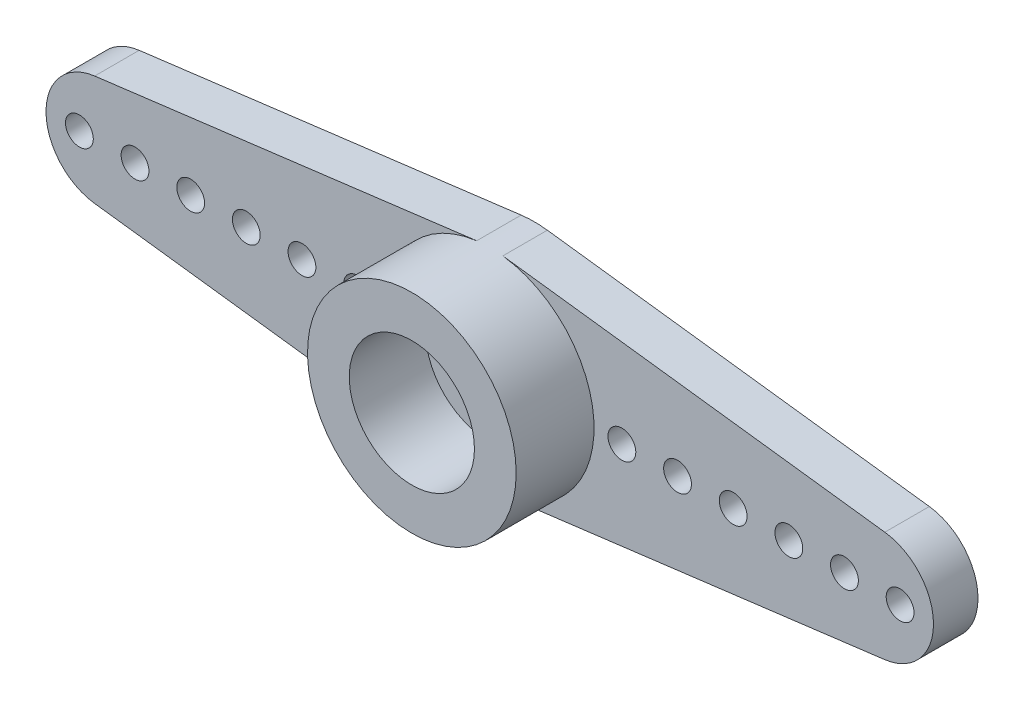
ISO-10303-21;
HEADER;
FILE_DESCRIPTION(('STEP AP214'),'2;1');
FILE_NAME('part.step','',(''),(''),'','','');
FILE_SCHEMA(('AUTOMOTIVE_DESIGN { 1 0 10303 214 1 1 1 1 }'));
ENDSEC;
DATA;
#1=APPLICATION_CONTEXT('core data for automotive mechanical design processes');
#2=APPLICATION_PROTOCOL_DEFINITION('international standard','automotive_design',2000,#1);
#3=PRODUCT_CONTEXT('',#1,'mechanical');
#4=PRODUCT('Part','Part','',(#3));
#5=PRODUCT_RELATED_PRODUCT_CATEGORY('part','',(#4));
#6=PRODUCT_DEFINITION_FORMATION('','',#4);
#7=PRODUCT_DEFINITION_CONTEXT('part definition',#1,'design');
#8=PRODUCT_DEFINITION('design','',#6,#7);
#9=PRODUCT_DEFINITION_SHAPE('','',#8);
#10=(LENGTH_UNIT() NAMED_UNIT(*) SI_UNIT(.MILLI.,.METRE.));
#11=(NAMED_UNIT(*) PLANE_ANGLE_UNIT() SI_UNIT($,.RADIAN.));
#12=(NAMED_UNIT(*) SI_UNIT($,.STERADIAN.) SOLID_ANGLE_UNIT());
#13=UNCERTAINTY_MEASURE_WITH_UNIT(LENGTH_MEASURE(1.E-05),#10,'distance_accuracy_value','');
#14=(GEOMETRIC_REPRESENTATION_CONTEXT(3) GLOBAL_UNCERTAINTY_ASSIGNED_CONTEXT((#13)) GLOBAL_UNIT_ASSIGNED_CONTEXT((#10,
#11,#12)) REPRESENTATION_CONTEXT('',''));
#15=CARTESIAN_POINT('',(0.,0.,0.));
#16=DIRECTION('',(0.,0.,1.));
#17=DIRECTION('',(1.,0.,0.));
#18=AXIS2_PLACEMENT_3D('',#15,#16,#17);
#19=CARTESIAN_POINT('',(0.,0.,4.4));
#20=DIRECTION('',(0.,0.,-1.));
#21=DIRECTION('',(-1.,0.,0.));
#22=AXIS2_PLACEMENT_3D('',#19,#20,#21);
#23=CYLINDRICAL_SURFACE('',#22,1.2);
#24=CARTESIAN_POINT('',(0.,0.,0.));
#25=DIRECTION('',(0.,0.,1.));
#26=DIRECTION('',(1.,0.,0.));
#27=AXIS2_PLACEMENT_3D('',#24,#25,#26);
#28=CIRCLE('',#27,1.2);
#29=CARTESIAN_POINT('',(1.2,0.,0.));
#30=VERTEX_POINT('',#29);
#31=EDGE_CURVE('E119',#30,#30,#28,.T.);
#32=ORIENTED_EDGE('',*,*,#31,.F.);
#33=EDGE_LOOP('',(#32));
#34=FACE_BOUND('',#33,.T.);
#35=CARTESIAN_POINT('',(0.,0.,1.65));
#36=DIRECTION('',(0.,0.,1.));
#37=DIRECTION('',(1.,0.,0.));
#38=AXIS2_PLACEMENT_3D('',#35,#36,#37);
#39=CIRCLE('',#38,1.2);
#40=CARTESIAN_POINT('',(1.2,0.,1.65));
#41=VERTEX_POINT('',#40);
#42=EDGE_CURVE('E36',#41,#41,#39,.T.);
#43=ORIENTED_EDGE('',*,*,#42,.T.);
#44=EDGE_LOOP('',(#43));
#45=FACE_BOUND('',#44,.T.);
#46=ADVANCED_FACE('F32',(#34,#45),#23,.F.);
#47=CARTESIAN_POINT('',(0.,0.,4.4));
#48=DIRECTION('',(0.,0.,-1.));
#49=DIRECTION('',(-1.,0.,0.));
#50=AXIS2_PLACEMENT_3D('',#47,#48,#49);
#51=CYLINDRICAL_SURFACE('',#50,3.75);
#52=CARTESIAN_POINT('',(0.,0.,4.4));
#53=DIRECTION('',(0.,0.,1.));
#54=DIRECTION('',(1.,0.,0.));
#55=AXIS2_PLACEMENT_3D('',#52,#53,#54);
#56=CIRCLE('',#55,3.75);
#57=CARTESIAN_POINT('',(3.75,0.,4.4));
#58=VERTEX_POINT('',#57);
#59=EDGE_CURVE('E125',#58,#58,#56,.T.);
#60=ORIENTED_EDGE('',*,*,#59,.F.);
#61=EDGE_LOOP('',(#60));
#62=FACE_BOUND('',#61,.T.);
#63=DIRECTION('',(0.,0.,-1.));
#64=VECTOR('',#63,1.);
#65=CARTESIAN_POINT('',(0.470430107526881,-3.72037572214585,1.6));
#66=LINE('',#65,#64);
#67=CARTESIAN_POINT('',(0.470430107526881,-3.72037572214585,1.6));
#68=VERTEX_POINT('',#67);
#69=CARTESIAN_POINT('',(0.470430107526881,-3.72037572214585,0.));
#70=VERTEX_POINT('',#69);
#71=EDGE_CURVE('E53',#68,#70,#66,.T.);
#72=ORIENTED_EDGE('',*,*,#71,.F.);
#73=CARTESIAN_POINT('',(0.,0.,1.6));
#74=DIRECTION('',(0.,0.,1.));
#75=DIRECTION('',(1.,0.,0.));
#76=AXIS2_PLACEMENT_3D('',#73,#74,#75);
#77=CIRCLE('',#76,3.75);
#78=CARTESIAN_POINT('',(0.470430107526882,3.72037572214585,1.6));
#79=VERTEX_POINT('',#78);
#80=EDGE_CURVE('E48',#68,#79,#77,.T.);
#81=ORIENTED_EDGE('',*,*,#80,.T.);
#82=DIRECTION('',(0.,0.,-1.));
#83=VECTOR('',#82,1.);
#84=CARTESIAN_POINT('',(0.470430107526881,3.72037572214585,1.6));
#85=LINE('',#84,#83);
#86=CARTESIAN_POINT('',(0.470430107526881,3.72037572214585,0.));
#87=VERTEX_POINT('',#86);
#88=EDGE_CURVE('E121',#79,#87,#85,.T.);
#89=ORIENTED_EDGE('',*,*,#88,.T.);
#90=CARTESIAN_POINT('',(0.,0.,0.));
#91=DIRECTION('',(0.,0.,1.));
#92=DIRECTION('',(1.,0.,0.));
#93=AXIS2_PLACEMENT_3D('',#90,#91,#92);
#94=CIRCLE('',#93,3.75);
#95=CARTESIAN_POINT('',(-0.470430107526882,3.72037572214585,0.));
#96=VERTEX_POINT('',#95);
#97=EDGE_CURVE('E132',#87,#96,#94,.T.);
#98=ORIENTED_EDGE('',*,*,#97,.T.);
#99=DIRECTION('',(0.,0.,-1.));
#100=VECTOR('',#99,1.);
#101=CARTESIAN_POINT('',(-0.470430107526882,3.72037572214585,1.6));
#102=LINE('',#101,#100);
#103=CARTESIAN_POINT('',(-0.470430107526882,3.72037572214585,1.6));
#104=VERTEX_POINT('',#103);
#105=EDGE_CURVE('E190',#104,#96,#102,.T.);
#106=ORIENTED_EDGE('',*,*,#105,.F.);
#107=CARTESIAN_POINT('',(0.,0.,1.6));
#108=DIRECTION('',(0.,0.,1.));
#109=DIRECTION('',(1.,0.,0.));
#110=AXIS2_PLACEMENT_3D('',#107,#108,#109);
#111=CIRCLE('',#110,3.75);
#112=CARTESIAN_POINT('',(-0.470430107526882,-3.72037572214585,1.6));
#113=VERTEX_POINT('',#112);
#114=EDGE_CURVE('E159',#104,#113,#111,.T.);
#115=ORIENTED_EDGE('',*,*,#114,.T.);
#116=DIRECTION('',(0.,0.,-1.));
#117=VECTOR('',#116,1.);
#118=CARTESIAN_POINT('',(-0.470430107526881,-3.72037572214585,1.6));
#119=LINE('',#118,#117);
#120=CARTESIAN_POINT('',(-0.470430107526881,-3.72037572214585,0.));
#121=VERTEX_POINT('',#120);
#122=EDGE_CURVE('E41',#113,#121,#119,.T.);
#123=ORIENTED_EDGE('',*,*,#122,.T.);
#124=EDGE_CURVE('E129',#121,#70,#94,.T.);
#125=ORIENTED_EDGE('',*,*,#124,.T.);
#126=EDGE_LOOP('',(#72,#81,#89,#98,#106,#115,#123,#125));
#127=FACE_BOUND('',#126,.T.);
#128=ADVANCED_FACE('F195',(#62,#127),#51,.T.);
#129=CARTESIAN_POINT('',(-13.95,0.,1.6));
#130=DIRECTION('',(0.,0.,-1.));
#131=DIRECTION('',(-1.,0.,0.));
#132=AXIS2_PLACEMENT_3D('',#129,#130,#131);
#133=CYLINDRICAL_SURFACE('',#132,2.);
#134=CARTESIAN_POINT('',(-13.95,0.,0.));
#135=DIRECTION('',(0.,0.,1.));
#136=DIRECTION('',(1.,0.,0.));
#137=AXIS2_PLACEMENT_3D('',#134,#135,#136);
#138=CIRCLE('',#137,2.);
#139=CARTESIAN_POINT('',(-14.2008960573477,1.98420038514445,0.));
#140=VERTEX_POINT('',#139);
#141=CARTESIAN_POINT('',(-14.2008960573477,-1.98420038514445,0.));
#142=VERTEX_POINT('',#141);
#143=EDGE_CURVE('E181',#140,#142,#138,.T.);
#144=ORIENTED_EDGE('',*,*,#143,.T.);
#145=DIRECTION('',(0.,0.,-1.));
#146=VECTOR('',#145,1.);
#147=CARTESIAN_POINT('',(-14.2008960573477,-1.98420038514445,1.6));
#148=LINE('',#147,#146);
#149=CARTESIAN_POINT('',(-14.2008960573477,-1.98420038514445,1.6));
#150=VERTEX_POINT('',#149);
#151=EDGE_CURVE('E11',#150,#142,#148,.T.);
#152=ORIENTED_EDGE('',*,*,#151,.F.);
#153=CARTESIAN_POINT('',(-13.95,0.,1.6));
#154=DIRECTION('',(0.,0.,1.));
#155=DIRECTION('',(1.,0.,0.));
#156=AXIS2_PLACEMENT_3D('',#153,#154,#155);
#157=CIRCLE('',#156,2.);
#158=CARTESIAN_POINT('',(-14.2008960573477,1.98420038514445,1.6));
#159=VERTEX_POINT('',#158);
#160=EDGE_CURVE('E153',#159,#150,#157,.T.);
#161=ORIENTED_EDGE('',*,*,#160,.F.);
#162=DIRECTION('',(0.,0.,-1.));
#163=VECTOR('',#162,1.);
#164=CARTESIAN_POINT('',(-14.2008960573477,1.98420038514445,1.6));
#165=LINE('',#164,#163);
#166=EDGE_CURVE('E163',#159,#140,#165,.T.);
#167=ORIENTED_EDGE('',*,*,#166,.T.);
#168=EDGE_LOOP('',(#144,#152,#161,#167));
#169=FACE_BOUND('',#168,.T.);
#170=ADVANCED_FACE('F260',(#169),#133,.T.);
#171=CARTESIAN_POINT('',(-0.470430107526882,-3.72037572214585,1.6));
#172=DIRECTION('',(0.125448028673835,0.992100192572226,0.));
#173=DIRECTION('',(-0.992100192572226,0.125448028673835,0.));
#174=AXIS2_PLACEMENT_3D('',#171,#172,#173);
#175=PLANE('',#174);
#176=DIRECTION('',(0.992100192572226,-0.125448028673835,0.));
#177=VECTOR('',#176,1.);
#178=CARTESIAN_POINT('',(-0.470430107526882,-3.72037572214585,0.));
#179=LINE('',#178,#177);
#180=EDGE_CURVE('E184',#142,#121,#179,.T.);
#181=ORIENTED_EDGE('',*,*,#180,.T.);
#182=ORIENTED_EDGE('',*,*,#122,.F.);
#183=DIRECTION('',(0.992100192572226,-0.125448028673835,0.));
#184=VECTOR('',#183,1.);
#185=CARTESIAN_POINT('',(-0.470430107526882,-3.72037572214585,1.6));
#186=LINE('',#185,#184);
#187=EDGE_CURVE('E156',#150,#113,#186,.T.);
#188=ORIENTED_EDGE('',*,*,#187,.F.);
#189=ORIENTED_EDGE('',*,*,#151,.T.);
#190=EDGE_LOOP('',(#181,#182,#188,#189));
#191=FACE_BOUND('',#190,.T.);
#192=ADVANCED_FACE('F198',(#191),#175,.F.);
#193=CARTESIAN_POINT('',(-4.75,0.,1.6));
#194=DIRECTION('',(0.,0.,-1.));
#195=DIRECTION('',(-1.,0.,0.));
#196=AXIS2_PLACEMENT_3D('',#193,#194,#195);
#197=CYLINDRICAL_SURFACE('',#196,0.5);
#198=CARTESIAN_POINT('',(-4.75,0.,1.6));
#199=DIRECTION('',(0.,0.,1.));
#200=DIRECTION('',(1.,0.,0.));
#201=AXIS2_PLACEMENT_3D('',#198,#199,#200);
#202=CIRCLE('',#201,0.5);
#203=CARTESIAN_POINT('',(-4.25,0.,1.6));
#204=VERTEX_POINT('',#203);
#205=EDGE_CURVE('E150',#204,#204,#202,.T.);
#206=ORIENTED_EDGE('',*,*,#205,.T.);
#207=EDGE_LOOP('',(#206));
#208=FACE_BOUND('',#207,.T.);
#209=CARTESIAN_POINT('',(-4.75,0.,0.));
#210=DIRECTION('',(0.,0.,1.));
#211=DIRECTION('',(1.,0.,0.));
#212=AXIS2_PLACEMENT_3D('',#209,#210,#211);
#213=CIRCLE('',#212,0.5);
#214=CARTESIAN_POINT('',(-4.25,0.,0.));
#215=VERTEX_POINT('',#214);
#216=EDGE_CURVE('E178',#215,#215,#213,.T.);
#217=ORIENTED_EDGE('',*,*,#216,.F.);
#218=EDGE_LOOP('',(#217));
#219=FACE_BOUND('',#218,.T.);
#220=ADVANCED_FACE('F281',(#208,#219),#197,.F.);
#221=CARTESIAN_POINT('',(-6.75,0.,1.6));
#222=DIRECTION('',(0.,0.,-1.));
#223=DIRECTION('',(-1.,0.,0.));
#224=AXIS2_PLACEMENT_3D('',#221,#222,#223);
#225=CYLINDRICAL_SURFACE('',#224,0.500000000000001);
#226=CARTESIAN_POINT('',(-6.75,0.,1.6));
#227=DIRECTION('',(0.,0.,1.));
#228=DIRECTION('',(1.,0.,0.));
#229=AXIS2_PLACEMENT_3D('',#226,#227,#228);
#230=CIRCLE('',#229,0.500000000000001);
#231=CARTESIAN_POINT('',(-6.25,0.,1.6));
#232=VERTEX_POINT('',#231);
#233=EDGE_CURVE('E147',#232,#232,#230,.T.);
#234=ORIENTED_EDGE('',*,*,#233,.T.);
#235=EDGE_LOOP('',(#234));
#236=FACE_BOUND('',#235,.T.);
#237=CARTESIAN_POINT('',(-6.75,0.,0.));
#238=DIRECTION('',(0.,0.,1.));
#239=DIRECTION('',(1.,0.,0.));
#240=AXIS2_PLACEMENT_3D('',#237,#238,#239);
#241=CIRCLE('',#240,0.500000000000001);
#242=CARTESIAN_POINT('',(-6.25,0.,0.));
#243=VERTEX_POINT('',#242);
#244=EDGE_CURVE('E175',#243,#243,#241,.T.);
#245=ORIENTED_EDGE('',*,*,#244,.F.);
#246=EDGE_LOOP('',(#245));
#247=FACE_BOUND('',#246,.T.);
#248=ADVANCED_FACE('F287',(#236,#247),#225,.F.);
#249=CARTESIAN_POINT('',(-8.75,0.,1.6));
#250=DIRECTION('',(0.,0.,-1.));
#251=DIRECTION('',(-1.,0.,0.));
#252=AXIS2_PLACEMENT_3D('',#249,#250,#251);
#253=CYLINDRICAL_SURFACE('',#252,0.500000000000001);
#254=CARTESIAN_POINT('',(-8.75,0.,1.6));
#255=DIRECTION('',(0.,0.,1.));
#256=DIRECTION('',(1.,0.,0.));
#257=AXIS2_PLACEMENT_3D('',#254,#255,#256);
#258=CIRCLE('',#257,0.500000000000001);
#259=CARTESIAN_POINT('',(-8.25,0.,1.6));
#260=VERTEX_POINT('',#259);
#261=EDGE_CURVE('E144',#260,#260,#258,.T.);
#262=ORIENTED_EDGE('',*,*,#261,.T.);
#263=EDGE_LOOP('',(#262));
#264=FACE_BOUND('',#263,.T.);
#265=CARTESIAN_POINT('',(-8.75,0.,0.));
#266=DIRECTION('',(0.,0.,1.));
#267=DIRECTION('',(1.,0.,0.));
#268=AXIS2_PLACEMENT_3D('',#265,#266,#267);
#269=CIRCLE('',#268,0.500000000000001);
#270=CARTESIAN_POINT('',(-8.25,0.,0.));
#271=VERTEX_POINT('',#270);
#272=EDGE_CURVE('E172',#271,#271,#269,.T.);
#273=ORIENTED_EDGE('',*,*,#272,.F.);
#274=EDGE_LOOP('',(#273));
#275=FACE_BOUND('',#274,.T.);
#276=ADVANCED_FACE('F291',(#264,#275),#253,.F.);
#277=CARTESIAN_POINT('',(-10.75,0.,1.6));
#278=DIRECTION('',(0.,0.,-1.));
#279=DIRECTION('',(-1.,0.,0.));
#280=AXIS2_PLACEMENT_3D('',#277,#278,#279);
#281=CYLINDRICAL_SURFACE('',#280,0.500000000000001);
#282=CARTESIAN_POINT('',(-10.75,0.,1.6));
#283=DIRECTION('',(0.,0.,1.));
#284=DIRECTION('',(1.,0.,0.));
#285=AXIS2_PLACEMENT_3D('',#282,#283,#284);
#286=CIRCLE('',#285,0.500000000000001);
#287=CARTESIAN_POINT('',(-10.25,0.,1.6));
#288=VERTEX_POINT('',#287);
#289=EDGE_CURVE('E141',#288,#288,#286,.T.);
#290=ORIENTED_EDGE('',*,*,#289,.T.);
#291=EDGE_LOOP('',(#290));
#292=FACE_BOUND('',#291,.T.);
#293=CARTESIAN_POINT('',(-10.75,0.,0.));
#294=DIRECTION('',(0.,0.,1.));
#295=DIRECTION('',(1.,0.,0.));
#296=AXIS2_PLACEMENT_3D('',#293,#294,#295);
#297=CIRCLE('',#296,0.500000000000001);
#298=CARTESIAN_POINT('',(-10.25,0.,0.));
#299=VERTEX_POINT('',#298);
#300=EDGE_CURVE('E169',#299,#299,#297,.T.);
#301=ORIENTED_EDGE('',*,*,#300,.F.);
#302=EDGE_LOOP('',(#301));
#303=FACE_BOUND('',#302,.T.);
#304=ADVANCED_FACE('F295',(#292,#303),#281,.F.);
#305=CARTESIAN_POINT('',(-12.75,0.,1.6));
#306=DIRECTION('',(0.,0.,-1.));
#307=DIRECTION('',(-1.,0.,0.));
#308=AXIS2_PLACEMENT_3D('',#305,#306,#307);
#309=CYLINDRICAL_SURFACE('',#308,0.500000000000001);
#310=CARTESIAN_POINT('',(-12.75,0.,1.6));
#311=DIRECTION('',(0.,0.,1.));
#312=DIRECTION('',(1.,0.,0.));
#313=AXIS2_PLACEMENT_3D('',#310,#311,#312);
#314=CIRCLE('',#313,0.500000000000001);
#315=CARTESIAN_POINT('',(-12.25,0.,1.6));
#316=VERTEX_POINT('',#315);
#317=EDGE_CURVE('E137',#316,#316,#314,.T.);
#318=ORIENTED_EDGE('',*,*,#317,.T.);
#319=EDGE_LOOP('',(#318));
#320=FACE_BOUND('',#319,.T.);
#321=CARTESIAN_POINT('',(-12.75,0.,0.));
#322=DIRECTION('',(0.,0.,1.));
#323=DIRECTION('',(1.,0.,0.));
#324=AXIS2_PLACEMENT_3D('',#321,#322,#323);
#325=CIRCLE('',#324,0.500000000000001);
#326=CARTESIAN_POINT('',(-12.25,0.,0.));
#327=VERTEX_POINT('',#326);
#328=EDGE_CURVE('E166',#327,#327,#325,.T.);
#329=ORIENTED_EDGE('',*,*,#328,.F.);
#330=EDGE_LOOP('',(#329));
#331=FACE_BOUND('',#330,.T.);
#332=ADVANCED_FACE('F298',(#320,#331),#309,.F.);
#333=CARTESIAN_POINT('',(-14.75,0.,1.6));
#334=DIRECTION('',(0.,0.,-1.));
#335=DIRECTION('',(-1.,0.,0.));
#336=AXIS2_PLACEMENT_3D('',#333,#334,#335);
#337=CYLINDRICAL_SURFACE('',#336,0.500000000000001);
#338=CARTESIAN_POINT('',(-14.75,0.,1.6));
#339=DIRECTION('',(0.,0.,1.));
#340=DIRECTION('',(1.,0.,0.));
#341=AXIS2_PLACEMENT_3D('',#338,#339,#340);
#342=CIRCLE('',#341,0.500000000000001);
#343=CARTESIAN_POINT('',(-14.25,0.,1.6));
#344=VERTEX_POINT('',#343);
#345=EDGE_CURVE('E134',#344,#344,#342,.T.);
#346=ORIENTED_EDGE('',*,*,#345,.T.);
#347=EDGE_LOOP('',(#346));
#348=FACE_BOUND('',#347,.T.);
#349=CARTESIAN_POINT('',(-14.75,0.,0.));
#350=DIRECTION('',(0.,0.,1.));
#351=DIRECTION('',(1.,0.,0.));
#352=AXIS2_PLACEMENT_3D('',#349,#350,#351);
#353=CIRCLE('',#352,0.500000000000001);
#354=CARTESIAN_POINT('',(-14.25,0.,0.));
#355=VERTEX_POINT('',#354);
#356=EDGE_CURVE('E128',#355,#355,#353,.T.);
#357=ORIENTED_EDGE('',*,*,#356,.F.);
#358=EDGE_LOOP('',(#357));
#359=FACE_BOUND('',#358,.T.);
#360=ADVANCED_FACE('F34',(#348,#359),#337,.F.);
#361=CARTESIAN_POINT('',(-0.470430107526882,3.72037572214585,1.6));
#362=DIRECTION('',(0.125448028673835,-0.992100192572226,0.));
#363=DIRECTION('',(0.992100192572226,0.125448028673835,0.));
#364=AXIS2_PLACEMENT_3D('',#361,#362,#363);
#365=PLANE('',#364);
#366=DIRECTION('',(-0.992100192572226,-0.125448028673835,0.));
#367=VECTOR('',#366,1.);
#368=CARTESIAN_POINT('',(-0.470430107526882,3.72037572214585,0.));
#369=LINE('',#368,#367);
#370=EDGE_CURVE('E138',#96,#140,#369,.T.);
#371=ORIENTED_EDGE('',*,*,#370,.T.);
#372=ORIENTED_EDGE('',*,*,#166,.F.);
#373=DIRECTION('',(-0.992100192572226,-0.125448028673835,0.));
#374=VECTOR('',#373,1.);
#375=CARTESIAN_POINT('',(-0.470430107526882,3.72037572214585,1.6));
#376=LINE('',#375,#374);
#377=EDGE_CURVE('E161',#104,#159,#376,.T.);
#378=ORIENTED_EDGE('',*,*,#377,.F.);
#379=ORIENTED_EDGE('',*,*,#105,.T.);
#380=EDGE_LOOP('',(#371,#372,#378,#379));
#381=FACE_BOUND('',#380,.T.);
#382=ADVANCED_FACE('F270',(#381),#365,.F.);
#383=CARTESIAN_POINT('',(0.,0.,1.6));
#384=DIRECTION('',(0.,0.,1.));
#385=DIRECTION('',(1.,0.,0.));
#386=AXIS2_PLACEMENT_3D('',#383,#384,#385);
#387=PLANE('',#386);
#388=ORIENTED_EDGE('',*,*,#345,.F.);
#389=EDGE_LOOP('',(#388));
#390=FACE_BOUND('',#389,.T.);
#391=ORIENTED_EDGE('',*,*,#317,.F.);
#392=EDGE_LOOP('',(#391));
#393=FACE_BOUND('',#392,.T.);
#394=ORIENTED_EDGE('',*,*,#289,.F.);
#395=EDGE_LOOP('',(#394));
#396=FACE_BOUND('',#395,.T.);
#397=ORIENTED_EDGE('',*,*,#261,.F.);
#398=EDGE_LOOP('',(#397));
#399=FACE_BOUND('',#398,.T.);
#400=ORIENTED_EDGE('',*,*,#233,.F.);
#401=EDGE_LOOP('',(#400));
#402=FACE_BOUND('',#401,.T.);
#403=ORIENTED_EDGE('',*,*,#205,.F.);
#404=EDGE_LOOP('',(#403));
#405=FACE_BOUND('',#404,.T.);
#406=ORIENTED_EDGE('',*,*,#160,.T.);
#407=ORIENTED_EDGE('',*,*,#187,.T.);
#408=ORIENTED_EDGE('',*,*,#114,.F.);
#409=ORIENTED_EDGE('',*,*,#377,.T.);
#410=EDGE_LOOP('',(#406,#407,#408,#409));
#411=FACE_BOUND('',#410,.T.);
#412=ADVANCED_FACE('F267',(#390,#393,#396,#399,#402,#405,#411),#387,.T.);
#413=CARTESIAN_POINT('',(0.,0.,0.));
#414=DIRECTION('',(0.,0.,1.));
#415=DIRECTION('',(1.,0.,0.));
#416=AXIS2_PLACEMENT_3D('',#413,#414,#415);
#417=PLANE('',#416);
#418=ORIENTED_EDGE('',*,*,#356,.T.);
#419=EDGE_LOOP('',(#418));
#420=FACE_BOUND('',#419,.T.);
#421=ORIENTED_EDGE('',*,*,#328,.T.);
#422=EDGE_LOOP('',(#421));
#423=FACE_BOUND('',#422,.T.);
#424=ORIENTED_EDGE('',*,*,#300,.T.);
#425=EDGE_LOOP('',(#424));
#426=FACE_BOUND('',#425,.T.);
#427=ORIENTED_EDGE('',*,*,#272,.T.);
#428=EDGE_LOOP('',(#427));
#429=FACE_BOUND('',#428,.T.);
#430=ORIENTED_EDGE('',*,*,#244,.T.);
#431=EDGE_LOOP('',(#430));
#432=FACE_BOUND('',#431,.T.);
#433=ORIENTED_EDGE('',*,*,#216,.T.);
#434=EDGE_LOOP('',(#433));
#435=FACE_BOUND('',#434,.T.);
#436=ORIENTED_EDGE('',*,*,#143,.F.);
#437=ORIENTED_EDGE('',*,*,#370,.F.);
#438=ORIENTED_EDGE('',*,*,#97,.F.);
#439=DIRECTION('',(-0.992100192572226,0.125448028673835,0.));
#440=VECTOR('',#439,1.);
#441=CARTESIAN_POINT('',(0.470430107526882,3.72037572214585,0.));
#442=LINE('',#441,#440);
#443=CARTESIAN_POINT('',(14.2008960573477,1.98420038514445,0.));
#444=VERTEX_POINT('',#443);
#445=EDGE_CURVE('E208',#444,#87,#442,.T.);
#446=ORIENTED_EDGE('',*,*,#445,.F.);
#447=CARTESIAN_POINT('',(13.95,0.,0.));
#448=DIRECTION('',(0.,0.,1.));
#449=DIRECTION('',(1.,0.,0.));
#450=AXIS2_PLACEMENT_3D('',#447,#448,#449);
#451=CIRCLE('',#450,2.);
#452=CARTESIAN_POINT('',(14.2008960573477,-1.98420038514445,0.));
#453=VERTEX_POINT('',#452);
#454=EDGE_CURVE('E205',#453,#444,#451,.T.);
#455=ORIENTED_EDGE('',*,*,#454,.F.);
#456=DIRECTION('',(0.992100192572226,0.125448028673835,0.));
#457=VECTOR('',#456,1.);
#458=CARTESIAN_POINT('',(0.470430107526882,-3.72037572214585,0.));
#459=LINE('',#458,#457);
#460=EDGE_CURVE('E117',#70,#453,#459,.T.);
#461=ORIENTED_EDGE('',*,*,#460,.F.);
#462=ORIENTED_EDGE('',*,*,#124,.F.);
#463=ORIENTED_EDGE('',*,*,#180,.F.);
#464=EDGE_LOOP('',(#436,#437,#438,#446,#455,#461,#462,#463));
#465=FACE_BOUND('',#464,.T.);
#466=ORIENTED_EDGE('',*,*,#31,.T.);
#467=EDGE_LOOP('',(#466));
#468=FACE_BOUND('',#467,.T.);
#469=CARTESIAN_POINT('',(4.75,0.,0.));
#470=DIRECTION('',(0.,0.,1.));
#471=DIRECTION('',(1.,0.,0.));
#472=AXIS2_PLACEMENT_3D('',#469,#470,#471);
#473=CIRCLE('',#472,0.5);
#474=CARTESIAN_POINT('',(5.25,0.,0.));
#475=VERTEX_POINT('',#474);
#476=EDGE_CURVE('E220',#475,#475,#473,.T.);
#477=ORIENTED_EDGE('',*,*,#476,.T.);
#478=EDGE_LOOP('',(#477));
#479=FACE_BOUND('',#478,.T.);
#480=CARTESIAN_POINT('',(6.75,0.,0.));
#481=DIRECTION('',(0.,0.,1.));
#482=DIRECTION('',(1.,0.,0.));
#483=AXIS2_PLACEMENT_3D('',#480,#481,#482);
#484=CIRCLE('',#483,0.500000000000001);
#485=CARTESIAN_POINT('',(7.25,0.,0.));
#486=VERTEX_POINT('',#485);
#487=EDGE_CURVE('E223',#486,#486,#484,.T.);
#488=ORIENTED_EDGE('',*,*,#487,.T.);
#489=EDGE_LOOP('',(#488));
#490=FACE_BOUND('',#489,.T.);
#491=CARTESIAN_POINT('',(8.75,0.,0.));
#492=DIRECTION('',(0.,0.,1.));
#493=DIRECTION('',(1.,0.,0.));
#494=AXIS2_PLACEMENT_3D('',#491,#492,#493);
#495=CIRCLE('',#494,0.500000000000001);
#496=CARTESIAN_POINT('',(9.25,0.,0.));
#497=VERTEX_POINT('',#496);
#498=EDGE_CURVE('E226',#497,#497,#495,.T.);
#499=ORIENTED_EDGE('',*,*,#498,.T.);
#500=EDGE_LOOP('',(#499));
#501=FACE_BOUND('',#500,.T.);
#502=CARTESIAN_POINT('',(10.75,0.,0.));
#503=DIRECTION('',(0.,0.,1.));
#504=DIRECTION('',(1.,0.,0.));
#505=AXIS2_PLACEMENT_3D('',#502,#503,#504);
#506=CIRCLE('',#505,0.500000000000001);
#507=CARTESIAN_POINT('',(11.25,0.,0.));
#508=VERTEX_POINT('',#507);
#509=EDGE_CURVE('E229',#508,#508,#506,.T.);
#510=ORIENTED_EDGE('',*,*,#509,.T.);
#511=EDGE_LOOP('',(#510));
#512=FACE_BOUND('',#511,.T.);
#513=CARTESIAN_POINT('',(12.75,0.,0.));
#514=DIRECTION('',(0.,0.,1.));
#515=DIRECTION('',(1.,0.,0.));
#516=AXIS2_PLACEMENT_3D('',#513,#514,#515);
#517=CIRCLE('',#516,0.500000000000001);
#518=CARTESIAN_POINT('',(13.25,0.,0.));
#519=VERTEX_POINT('',#518);
#520=EDGE_CURVE('E211',#519,#519,#517,.T.);
#521=ORIENTED_EDGE('',*,*,#520,.T.);
#522=EDGE_LOOP('',(#521));
#523=FACE_BOUND('',#522,.T.);
#524=CARTESIAN_POINT('',(14.75,0.,0.));
#525=DIRECTION('',(0.,0.,1.));
#526=DIRECTION('',(1.,0.,0.));
#527=AXIS2_PLACEMENT_3D('',#524,#525,#526);
#528=CIRCLE('',#527,0.500000000000001);
#529=CARTESIAN_POINT('',(15.25,0.,0.));
#530=VERTEX_POINT('',#529);
#531=EDGE_CURVE('E206',#530,#530,#528,.T.);
#532=ORIENTED_EDGE('',*,*,#531,.T.);
#533=EDGE_LOOP('',(#532));
#534=FACE_BOUND('',#533,.T.);
#535=ADVANCED_FACE('F202',(#420,#423,#426,#429,#432,#435,#465,#468,#479,#490,#501,#512,#523,
#534),#417,.F.);
#536=CARTESIAN_POINT('',(0.,0.,4.4));
#537=DIRECTION('',(0.,0.,1.));
#538=DIRECTION('',(1.,0.,0.));
#539=AXIS2_PLACEMENT_3D('',#536,#537,#538);
#540=PLANE('',#539);
#541=CARTESIAN_POINT('',(0.,0.,4.4));
#542=DIRECTION('',(0.,0.,1.));
#543=DIRECTION('',(1.,0.,0.));
#544=AXIS2_PLACEMENT_3D('',#541,#542,#543);
#545=CIRCLE('',#544,2.25);
#546=CARTESIAN_POINT('',(2.25,0.,4.4));
#547=VERTEX_POINT('',#546);
#548=EDGE_CURVE('E403',#547,#547,#545,.T.);
#549=ORIENTED_EDGE('',*,*,#548,.F.);
#550=EDGE_LOOP('',(#549));
#551=FACE_BOUND('',#550,.T.);
#552=ORIENTED_EDGE('',*,*,#59,.T.);
#553=EDGE_LOOP('',(#552));
#554=FACE_BOUND('',#553,.T.);
#555=ADVANCED_FACE('F274',(#551,#554),#540,.T.);
#556=CARTESIAN_POINT('',(0.470430107526882,-3.72037572214585,1.6));
#557=DIRECTION('',(-0.125448028673835,0.992100192572226,0.));
#558=DIRECTION('',(-0.992100192572226,-0.125448028673835,0.));
#559=AXIS2_PLACEMENT_3D('',#556,#557,#558);
#560=PLANE('',#559);
#561=ORIENTED_EDGE('',*,*,#460,.T.);
#562=DIRECTION('',(0.,0.,-1.));
#563=VECTOR('',#562,1.);
#564=CARTESIAN_POINT('',(14.2008960573477,-1.98420038514445,1.6));
#565=LINE('',#564,#563);
#566=CARTESIAN_POINT('',(14.2008960573477,-1.98420038514445,1.6));
#567=VERTEX_POINT('',#566);
#568=EDGE_CURVE('E104',#567,#453,#565,.T.);
#569=ORIENTED_EDGE('',*,*,#568,.F.);
#570=DIRECTION('',(0.992100192572226,0.125448028673835,0.));
#571=VECTOR('',#570,1.);
#572=CARTESIAN_POINT('',(0.470430107526882,-3.72037572214585,1.6));
#573=LINE('',#572,#571);
#574=EDGE_CURVE('E110',#68,#567,#573,.T.);
#575=ORIENTED_EDGE('',*,*,#574,.F.);
#576=ORIENTED_EDGE('',*,*,#71,.T.);
#577=EDGE_LOOP('',(#561,#569,#575,#576));
#578=FACE_BOUND('',#577,.T.);
#579=ADVANCED_FACE('F115',(#578),#560,.F.);
#580=CARTESIAN_POINT('',(13.95,0.,1.6));
#581=DIRECTION('',(0.,0.,-1.));
#582=DIRECTION('',(-1.,0.,0.));
#583=AXIS2_PLACEMENT_3D('',#580,#581,#582);
#584=CYLINDRICAL_SURFACE('',#583,2.);
#585=ORIENTED_EDGE('',*,*,#454,.T.);
#586=DIRECTION('',(0.,0.,-1.));
#587=VECTOR('',#586,1.);
#588=CARTESIAN_POINT('',(14.2008960573477,1.98420038514445,1.6));
#589=LINE('',#588,#587);
#590=CARTESIAN_POINT('',(14.2008960573477,1.98420038514445,1.6));
#591=VERTEX_POINT('',#590);
#592=EDGE_CURVE('E107',#591,#444,#589,.T.);
#593=ORIENTED_EDGE('',*,*,#592,.F.);
#594=CARTESIAN_POINT('',(13.95,0.,1.6));
#595=DIRECTION('',(0.,0.,1.));
#596=DIRECTION('',(1.,0.,0.));
#597=AXIS2_PLACEMENT_3D('',#594,#595,#596);
#598=CIRCLE('',#597,2.);
#599=EDGE_CURVE('E99',#567,#591,#598,.T.);
#600=ORIENTED_EDGE('',*,*,#599,.F.);
#601=ORIENTED_EDGE('',*,*,#568,.T.);
#602=EDGE_LOOP('',(#585,#593,#600,#601));
#603=FACE_BOUND('',#602,.T.);
#604=ADVANCED_FACE('F102',(#603),#584,.T.);
#605=CARTESIAN_POINT('',(14.75,0.,1.6));
#606=DIRECTION('',(0.,0.,-1.));
#607=DIRECTION('',(-1.,0.,0.));
#608=AXIS2_PLACEMENT_3D('',#605,#606,#607);
#609=CYLINDRICAL_SURFACE('',#608,0.500000000000001);
#610=CARTESIAN_POINT('',(14.75,0.,1.6));
#611=DIRECTION('',(0.,0.,1.));
#612=DIRECTION('',(1.,0.,0.));
#613=AXIS2_PLACEMENT_3D('',#610,#611,#612);
#614=CIRCLE('',#613,0.500000000000001);
#615=CARTESIAN_POINT('',(15.25,0.,1.6));
#616=VERTEX_POINT('',#615);
#617=EDGE_CURVE('E392',#616,#616,#614,.T.);
#618=ORIENTED_EDGE('',*,*,#617,.T.);
#619=EDGE_LOOP('',(#618));
#620=FACE_BOUND('',#619,.T.);
#621=ORIENTED_EDGE('',*,*,#531,.F.);
#622=EDGE_LOOP('',(#621));
#623=FACE_BOUND('',#622,.T.);
#624=ADVANCED_FACE('F239',(#620,#623),#609,.F.);
#625=CARTESIAN_POINT('',(12.75,0.,1.6));
#626=DIRECTION('',(0.,0.,-1.));
#627=DIRECTION('',(-1.,0.,0.));
#628=AXIS2_PLACEMENT_3D('',#625,#626,#627);
#629=CYLINDRICAL_SURFACE('',#628,0.500000000000001);
#630=CARTESIAN_POINT('',(12.75,0.,1.6));
#631=DIRECTION('',(0.,0.,1.));
#632=DIRECTION('',(1.,0.,0.));
#633=AXIS2_PLACEMENT_3D('',#630,#631,#632);
#634=CIRCLE('',#633,0.500000000000001);
#635=CARTESIAN_POINT('',(13.25,0.,1.6));
#636=VERTEX_POINT('',#635);
#637=EDGE_CURVE('E385',#636,#636,#634,.T.);
#638=ORIENTED_EDGE('',*,*,#637,.T.);
#639=EDGE_LOOP('',(#638));
#640=FACE_BOUND('',#639,.T.);
#641=ORIENTED_EDGE('',*,*,#520,.F.);
#642=EDGE_LOOP('',(#641));
#643=FACE_BOUND('',#642,.T.);
#644=ADVANCED_FACE('F236',(#640,#643),#629,.F.);
#645=CARTESIAN_POINT('',(10.75,0.,1.6));
#646=DIRECTION('',(0.,0.,-1.));
#647=DIRECTION('',(-1.,0.,0.));
#648=AXIS2_PLACEMENT_3D('',#645,#646,#647);
#649=CYLINDRICAL_SURFACE('',#648,0.500000000000001);
#650=CARTESIAN_POINT('',(10.75,0.,1.6));
#651=DIRECTION('',(0.,0.,1.));
#652=DIRECTION('',(1.,0.,0.));
#653=AXIS2_PLACEMENT_3D('',#650,#651,#652);
#654=CIRCLE('',#653,0.500000000000001);
#655=CARTESIAN_POINT('',(11.25,0.,1.6));
#656=VERTEX_POINT('',#655);
#657=EDGE_CURVE('E381',#656,#656,#654,.T.);
#658=ORIENTED_EDGE('',*,*,#657,.T.);
#659=EDGE_LOOP('',(#658));
#660=FACE_BOUND('',#659,.T.);
#661=ORIENTED_EDGE('',*,*,#509,.F.);
#662=EDGE_LOOP('',(#661));
#663=FACE_BOUND('',#662,.T.);
#664=ADVANCED_FACE('F238',(#660,#663),#649,.F.);
#665=CARTESIAN_POINT('',(8.75,0.,1.6));
#666=DIRECTION('',(0.,0.,-1.));
#667=DIRECTION('',(-1.,0.,0.));
#668=AXIS2_PLACEMENT_3D('',#665,#666,#667);
#669=CYLINDRICAL_SURFACE('',#668,0.500000000000001);
#670=CARTESIAN_POINT('',(8.75,0.,1.6));
#671=DIRECTION('',(0.,0.,1.));
#672=DIRECTION('',(1.,0.,0.));
#673=AXIS2_PLACEMENT_3D('',#670,#671,#672);
#674=CIRCLE('',#673,0.500000000000001);
#675=CARTESIAN_POINT('',(9.25,0.,1.6));
#676=VERTEX_POINT('',#675);
#677=EDGE_CURVE('E374',#676,#676,#674,.T.);
#678=ORIENTED_EDGE('',*,*,#677,.T.);
#679=EDGE_LOOP('',(#678));
#680=FACE_BOUND('',#679,.T.);
#681=ORIENTED_EDGE('',*,*,#498,.F.);
#682=EDGE_LOOP('',(#681));
#683=FACE_BOUND('',#682,.T.);
#684=ADVANCED_FACE('F246',(#680,#683),#669,.F.);
#685=CARTESIAN_POINT('',(6.75,0.,1.6));
#686=DIRECTION('',(0.,0.,-1.));
#687=DIRECTION('',(-1.,0.,0.));
#688=AXIS2_PLACEMENT_3D('',#685,#686,#687);
#689=CYLINDRICAL_SURFACE('',#688,0.500000000000001);
#690=CARTESIAN_POINT('',(6.75,0.,1.6));
#691=DIRECTION('',(0.,0.,1.));
#692=DIRECTION('',(1.,0.,0.));
#693=AXIS2_PLACEMENT_3D('',#690,#691,#692);
#694=CIRCLE('',#693,0.500000000000001);
#695=CARTESIAN_POINT('',(7.25,0.,1.6));
#696=VERTEX_POINT('',#695);
#697=EDGE_CURVE('E382',#696,#696,#694,.T.);
#698=ORIENTED_EDGE('',*,*,#697,.T.);
#699=EDGE_LOOP('',(#698));
#700=FACE_BOUND('',#699,.T.);
#701=ORIENTED_EDGE('',*,*,#487,.F.);
#702=EDGE_LOOP('',(#701));
#703=FACE_BOUND('',#702,.T.);
#704=ADVANCED_FACE('F347',(#700,#703),#689,.F.);
#705=CARTESIAN_POINT('',(4.75,0.,1.6));
#706=DIRECTION('',(0.,0.,-1.));
#707=DIRECTION('',(-1.,0.,0.));
#708=AXIS2_PLACEMENT_3D('',#705,#706,#707);
#709=CYLINDRICAL_SURFACE('',#708,0.5);
#710=CARTESIAN_POINT('',(4.75,0.,1.6));
#711=DIRECTION('',(0.,0.,1.));
#712=DIRECTION('',(1.,0.,0.));
#713=AXIS2_PLACEMENT_3D('',#710,#711,#712);
#714=CIRCLE('',#713,0.5);
#715=CARTESIAN_POINT('',(5.25,0.,1.6));
#716=VERTEX_POINT('',#715);
#717=EDGE_CURVE('E216',#716,#716,#714,.T.);
#718=ORIENTED_EDGE('',*,*,#717,.T.);
#719=EDGE_LOOP('',(#718));
#720=FACE_BOUND('',#719,.T.);
#721=ORIENTED_EDGE('',*,*,#476,.F.);
#722=EDGE_LOOP('',(#721));
#723=FACE_BOUND('',#722,.T.);
#724=ADVANCED_FACE('F338',(#720,#723),#709,.F.);
#725=CARTESIAN_POINT('',(0.470430107526882,3.72037572214585,1.6));
#726=DIRECTION('',(-0.125448028673835,-0.992100192572226,0.));
#727=DIRECTION('',(0.992100192572226,-0.125448028673835,0.));
#728=AXIS2_PLACEMENT_3D('',#725,#726,#727);
#729=PLANE('',#728);
#730=ORIENTED_EDGE('',*,*,#445,.T.);
#731=ORIENTED_EDGE('',*,*,#88,.F.);
#732=DIRECTION('',(-0.992100192572226,0.125448028673835,0.));
#733=VECTOR('',#732,1.);
#734=CARTESIAN_POINT('',(0.470430107526882,3.72037572214585,1.6));
#735=LINE('',#734,#733);
#736=EDGE_CURVE('E109',#591,#79,#735,.T.);
#737=ORIENTED_EDGE('',*,*,#736,.F.);
#738=ORIENTED_EDGE('',*,*,#592,.T.);
#739=EDGE_LOOP('',(#730,#731,#737,#738));
#740=FACE_BOUND('',#739,.T.);
#741=ADVANCED_FACE('F336',(#740),#729,.F.);
#742=CARTESIAN_POINT('',(0.,0.,1.6));
#743=DIRECTION('',(0.,0.,1.));
#744=DIRECTION('',(1.,0.,0.));
#745=AXIS2_PLACEMENT_3D('',#742,#743,#744);
#746=PLANE('',#745);
#747=ORIENTED_EDGE('',*,*,#717,.F.);
#748=EDGE_LOOP('',(#747));
#749=FACE_BOUND('',#748,.T.);
#750=ORIENTED_EDGE('',*,*,#697,.F.);
#751=EDGE_LOOP('',(#750));
#752=FACE_BOUND('',#751,.T.);
#753=ORIENTED_EDGE('',*,*,#677,.F.);
#754=EDGE_LOOP('',(#753));
#755=FACE_BOUND('',#754,.T.);
#756=ORIENTED_EDGE('',*,*,#657,.F.);
#757=EDGE_LOOP('',(#756));
#758=FACE_BOUND('',#757,.T.);
#759=ORIENTED_EDGE('',*,*,#637,.F.);
#760=EDGE_LOOP('',(#759));
#761=FACE_BOUND('',#760,.T.);
#762=ORIENTED_EDGE('',*,*,#617,.F.);
#763=EDGE_LOOP('',(#762));
#764=FACE_BOUND('',#763,.T.);
#765=ORIENTED_EDGE('',*,*,#80,.F.);
#766=ORIENTED_EDGE('',*,*,#574,.T.);
#767=ORIENTED_EDGE('',*,*,#599,.T.);
#768=ORIENTED_EDGE('',*,*,#736,.T.);
#769=EDGE_LOOP('',(#765,#766,#767,#768));
#770=FACE_BOUND('',#769,.T.);
#771=ADVANCED_FACE('F112',(#749,#752,#755,#758,#761,#764,#770),#746,.T.);
#772=CARTESIAN_POINT('',(0.,0.,1.65));
#773=DIRECTION('',(0.,0.,1.));
#774=DIRECTION('',(1.,0.,0.));
#775=AXIS2_PLACEMENT_3D('',#772,#773,#774);
#776=CYLINDRICAL_SURFACE('',#775,2.25);
#777=CARTESIAN_POINT('',(0.,0.,1.65));
#778=DIRECTION('',(0.,0.,1.));
#779=DIRECTION('',(1.,0.,0.));
#780=AXIS2_PLACEMENT_3D('',#777,#778,#779);
#781=CIRCLE('',#780,2.25);
#782=CARTESIAN_POINT('',(2.25,0.,1.65));
#783=VERTEX_POINT('',#782);
#784=EDGE_CURVE('E406',#783,#783,#781,.T.);
#785=ORIENTED_EDGE('',*,*,#784,.F.);
#786=EDGE_LOOP('',(#785));
#787=FACE_BOUND('',#786,.T.);
#788=ORIENTED_EDGE('',*,*,#548,.T.);
#789=EDGE_LOOP('',(#788));
#790=FACE_BOUND('',#789,.T.);
#791=ADVANCED_FACE('F344',(#787,#790),#776,.F.);
#792=CARTESIAN_POINT('',(0.,0.,1.65));
#793=DIRECTION('',(0.,0.,1.));
#794=DIRECTION('',(1.,0.,0.));
#795=AXIS2_PLACEMENT_3D('',#792,#793,#794);
#796=PLANE('',#795);
#797=ORIENTED_EDGE('',*,*,#42,.F.);
#798=EDGE_LOOP('',(#797));
#799=FACE_BOUND('',#798,.T.);
#800=ORIENTED_EDGE('',*,*,#784,.T.);
#801=EDGE_LOOP('',(#800));
#802=FACE_BOUND('',#801,.T.);
#803=ADVANCED_FACE('F413',(#799,#802),#796,.T.);
#804=CLOSED_SHELL('',(#46,#128,#170,#192,#220,#248,#276,#304,#332,#360,#382,#412,#535,#555,#579,
#604,#624,#644,#664,#684,#704,#724,#741,#771,#791,#803));
#805=MANIFOLD_SOLID_BREP('B2',#804);
#806=ADVANCED_BREP_SHAPE_REPRESENTATION('',(#18,#805),#14);
#807=SHAPE_DEFINITION_REPRESENTATION(#9,#806);
ENDSEC;
END-ISO-10303-21;
